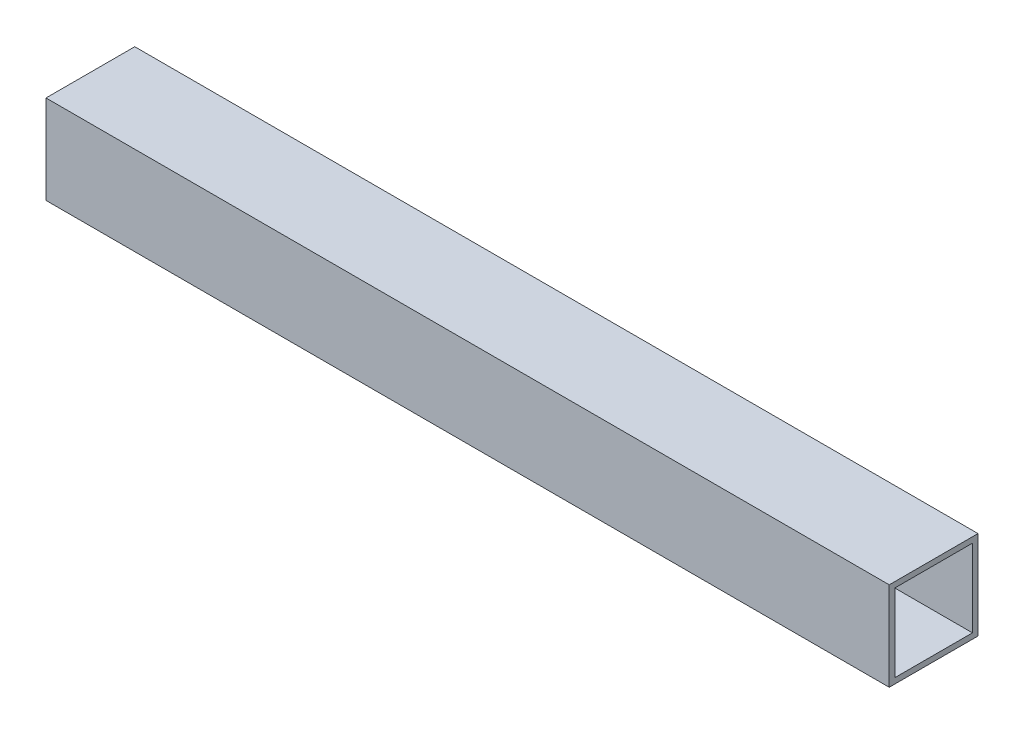
ISO-10303-21;
HEADER;
FILE_DESCRIPTION(('STEP AP214'),'2;1');
FILE_NAME('part.step','',(''),(''),'','','');
FILE_SCHEMA(('AUTOMOTIVE_DESIGN { 1 0 10303 214 1 1 1 1 }'));
ENDSEC;
DATA;
#1=APPLICATION_CONTEXT('core data for automotive mechanical design processes');
#2=APPLICATION_PROTOCOL_DEFINITION('international standard','automotive_design',2000,#1);
#3=PRODUCT_CONTEXT('',#1,'mechanical');
#4=PRODUCT('Part','Part','',(#3));
#5=PRODUCT_RELATED_PRODUCT_CATEGORY('part','',(#4));
#6=PRODUCT_DEFINITION_FORMATION('','',#4);
#7=PRODUCT_DEFINITION_CONTEXT('part definition',#1,'design');
#8=PRODUCT_DEFINITION('design','',#6,#7);
#9=PRODUCT_DEFINITION_SHAPE('','',#8);
#10=(LENGTH_UNIT() NAMED_UNIT(*) SI_UNIT(.MILLI.,.METRE.));
#11=(NAMED_UNIT(*) PLANE_ANGLE_UNIT() SI_UNIT($,.RADIAN.));
#12=(NAMED_UNIT(*) SI_UNIT($,.STERADIAN.) SOLID_ANGLE_UNIT());
#13=UNCERTAINTY_MEASURE_WITH_UNIT(LENGTH_MEASURE(1.E-05),#10,'distance_accuracy_value','');
#14=(GEOMETRIC_REPRESENTATION_CONTEXT(3) GLOBAL_UNCERTAINTY_ASSIGNED_CONTEXT((#13)) GLOBAL_UNIT_ASSIGNED_CONTEXT((#10,
#11,#12)) REPRESENTATION_CONTEXT('',''));
#15=CARTESIAN_POINT('',(0.,0.,0.));
#16=DIRECTION('',(0.,0.,1.));
#17=DIRECTION('',(1.,0.,0.));
#18=AXIS2_PLACEMENT_3D('',#15,#16,#17);
#19=CARTESIAN_POINT('',(241.3,0.,0.));
#20=DIRECTION('',(1.,0.,0.));
#21=DIRECTION('',(0.,0.,-1.));
#22=AXIS2_PLACEMENT_3D('',#19,#20,#21);
#23=PLANE('',#22);
#24=DIRECTION('',(0.,1.,0.));
#25=VECTOR('',#24,1.);
#26=CARTESIAN_POINT('',(241.3,25.4,-25.4));
#27=LINE('',#26,#25);
#28=CARTESIAN_POINT('',(241.3,-25.4,-25.4));
#29=VERTEX_POINT('',#28);
#30=CARTESIAN_POINT('',(241.3,25.4,-25.4));
#31=VERTEX_POINT('',#30);
#32=EDGE_CURVE('E138',#29,#31,#27,.T.);
#33=ORIENTED_EDGE('',*,*,#32,.T.);
#34=DIRECTION('',(0.,0.,1.));
#35=VECTOR('',#34,1.);
#36=CARTESIAN_POINT('',(241.3,25.4,25.4));
#37=LINE('',#36,#35);
#38=CARTESIAN_POINT('',(241.3,25.4,25.4));
#39=VERTEX_POINT('',#38);
#40=EDGE_CURVE('E141',#31,#39,#37,.T.);
#41=ORIENTED_EDGE('',*,*,#40,.T.);
#42=DIRECTION('',(0.,-1.,0.));
#43=VECTOR('',#42,1.);
#44=CARTESIAN_POINT('',(241.3,25.4,25.4));
#45=LINE('',#44,#43);
#46=CARTESIAN_POINT('',(241.3,-25.4,25.4));
#47=VERTEX_POINT('',#46);
#48=EDGE_CURVE('E144',#39,#47,#45,.T.);
#49=ORIENTED_EDGE('',*,*,#48,.T.);
#50=DIRECTION('',(0.,0.,-1.));
#51=VECTOR('',#50,1.);
#52=CARTESIAN_POINT('',(241.3,-25.4,25.4));
#53=LINE('',#52,#51);
#54=EDGE_CURVE('E146',#47,#29,#53,.T.);
#55=ORIENTED_EDGE('',*,*,#54,.T.);
#56=EDGE_LOOP('',(#33,#41,#49,#55));
#57=FACE_BOUND('',#56,.T.);
#58=DIRECTION('',(0.,-1.,0.));
#59=VECTOR('',#58,1.);
#60=CARTESIAN_POINT('',(241.3,22.225,22.225));
#61=LINE('',#60,#59);
#62=CARTESIAN_POINT('',(241.3,22.225,22.225));
#63=VERTEX_POINT('',#62);
#64=CARTESIAN_POINT('',(241.3,-22.225,22.225));
#65=VERTEX_POINT('',#64);
#66=EDGE_CURVE('E110',#63,#65,#61,.T.);
#67=ORIENTED_EDGE('',*,*,#66,.F.);
#68=DIRECTION('',(0.,0.,1.));
#69=VECTOR('',#68,1.);
#70=CARTESIAN_POINT('',(241.3,22.225,22.225));
#71=LINE('',#70,#69);
#72=CARTESIAN_POINT('',(241.3,22.225,-22.225));
#73=VERTEX_POINT('',#72);
#74=EDGE_CURVE('E102',#73,#63,#71,.T.);
#75=ORIENTED_EDGE('',*,*,#74,.F.);
#76=DIRECTION('',(0.,1.,0.));
#77=VECTOR('',#76,1.);
#78=CARTESIAN_POINT('',(241.3,22.225,-22.225));
#79=LINE('',#78,#77);
#80=CARTESIAN_POINT('',(241.3,-22.225,-22.225));
#81=VERTEX_POINT('',#80);
#82=EDGE_CURVE('E124',#81,#73,#79,.T.);
#83=ORIENTED_EDGE('',*,*,#82,.F.);
#84=DIRECTION('',(0.,0.,-1.));
#85=VECTOR('',#84,1.);
#86=CARTESIAN_POINT('',(241.3,-22.225,22.225));
#87=LINE('',#86,#85);
#88=EDGE_CURVE('E122',#65,#81,#87,.T.);
#89=ORIENTED_EDGE('',*,*,#88,.F.);
#90=EDGE_LOOP('',(#67,#75,#83,#89));
#91=FACE_BOUND('',#90,.T.);
#92=ADVANCED_FACE('F37',(#57,#91),#23,.T.);
#93=CARTESIAN_POINT('',(-241.3,0.,0.));
#94=DIRECTION('',(1.,0.,0.));
#95=DIRECTION('',(0.,0.,-1.));
#96=AXIS2_PLACEMENT_3D('',#93,#94,#95);
#97=PLANE('',#96);
#98=DIRECTION('',(0.,1.,0.));
#99=VECTOR('',#98,1.);
#100=CARTESIAN_POINT('',(-241.3,25.4,-25.4));
#101=LINE('',#100,#99);
#102=CARTESIAN_POINT('',(-241.3,-25.4,-25.4));
#103=VERTEX_POINT('',#102);
#104=CARTESIAN_POINT('',(-241.3,25.4,-25.4));
#105=VERTEX_POINT('',#104);
#106=EDGE_CURVE('E118',#103,#105,#101,.T.);
#107=ORIENTED_EDGE('',*,*,#106,.F.);
#108=DIRECTION('',(0.,0.,-1.));
#109=VECTOR('',#108,1.);
#110=CARTESIAN_POINT('',(-241.3,-25.4,25.4));
#111=LINE('',#110,#109);
#112=CARTESIAN_POINT('',(-241.3,-25.4,25.4));
#113=VERTEX_POINT('',#112);
#114=EDGE_CURVE('E142',#113,#103,#111,.T.);
#115=ORIENTED_EDGE('',*,*,#114,.F.);
#116=DIRECTION('',(0.,-1.,0.));
#117=VECTOR('',#116,1.);
#118=CARTESIAN_POINT('',(-241.3,25.4,25.4));
#119=LINE('',#118,#117);
#120=CARTESIAN_POINT('',(-241.3,25.4,25.4));
#121=VERTEX_POINT('',#120);
#122=EDGE_CURVE('E153',#121,#113,#119,.T.);
#123=ORIENTED_EDGE('',*,*,#122,.F.);
#124=DIRECTION('',(0.,0.,1.));
#125=VECTOR('',#124,1.);
#126=CARTESIAN_POINT('',(-241.3,25.4,25.4));
#127=LINE('',#126,#125);
#128=EDGE_CURVE('E151',#105,#121,#127,.T.);
#129=ORIENTED_EDGE('',*,*,#128,.F.);
#130=EDGE_LOOP('',(#107,#115,#123,#129));
#131=FACE_BOUND('',#130,.T.);
#132=DIRECTION('',(0.,0.,1.));
#133=VECTOR('',#132,1.);
#134=CARTESIAN_POINT('',(-241.3,22.225,22.225));
#135=LINE('',#134,#133);
#136=CARTESIAN_POINT('',(-241.3,22.225,-22.225));
#137=VERTEX_POINT('',#136);
#138=CARTESIAN_POINT('',(-241.3,22.225,22.225));
#139=VERTEX_POINT('',#138);
#140=EDGE_CURVE('E60',#137,#139,#135,.T.);
#141=ORIENTED_EDGE('',*,*,#140,.T.);
#142=DIRECTION('',(0.,-1.,0.));
#143=VECTOR('',#142,1.);
#144=CARTESIAN_POINT('',(-241.3,22.225,22.225));
#145=LINE('',#144,#143);
#146=CARTESIAN_POINT('',(-241.3,-22.225,22.225));
#147=VERTEX_POINT('',#146);
#148=EDGE_CURVE('E117',#139,#147,#145,.T.);
#149=ORIENTED_EDGE('',*,*,#148,.T.);
#150=DIRECTION('',(0.,0.,-1.));
#151=VECTOR('',#150,1.);
#152=CARTESIAN_POINT('',(-241.3,-22.225,22.225));
#153=LINE('',#152,#151);
#154=CARTESIAN_POINT('',(-241.3,-22.225,-22.225));
#155=VERTEX_POINT('',#154);
#156=EDGE_CURVE('E130',#147,#155,#153,.T.);
#157=ORIENTED_EDGE('',*,*,#156,.T.);
#158=DIRECTION('',(0.,1.,0.));
#159=VECTOR('',#158,1.);
#160=CARTESIAN_POINT('',(-241.3,22.225,-22.225));
#161=LINE('',#160,#159);
#162=EDGE_CURVE('E111',#155,#137,#161,.T.);
#163=ORIENTED_EDGE('',*,*,#162,.T.);
#164=EDGE_LOOP('',(#141,#149,#157,#163));
#165=FACE_BOUND('',#164,.T.);
#166=ADVANCED_FACE('F171',(#131,#165),#97,.F.);
#167=CARTESIAN_POINT('',(241.3,25.4,-25.4));
#168=DIRECTION('',(0.,0.,1.));
#169=DIRECTION('',(0.,-1.,0.));
#170=AXIS2_PLACEMENT_3D('',#167,#168,#169);
#171=PLANE('',#170);
#172=ORIENTED_EDGE('',*,*,#106,.T.);
#173=DIRECTION('',(-1.,0.,0.));
#174=VECTOR('',#173,1.);
#175=CARTESIAN_POINT('',(241.3,25.4,-25.4));
#176=LINE('',#175,#174);
#177=EDGE_CURVE('E11',#31,#105,#176,.T.);
#178=ORIENTED_EDGE('',*,*,#177,.F.);
#179=ORIENTED_EDGE('',*,*,#32,.F.);
#180=DIRECTION('',(-1.,0.,0.));
#181=VECTOR('',#180,1.);
#182=CARTESIAN_POINT('',(241.3,-25.4,-25.4));
#183=LINE('',#182,#181);
#184=EDGE_CURVE('E148',#29,#103,#183,.T.);
#185=ORIENTED_EDGE('',*,*,#184,.T.);
#186=EDGE_LOOP('',(#172,#178,#179,#185));
#187=FACE_BOUND('',#186,.T.);
#188=ADVANCED_FACE('F39',(#187),#171,.F.);
#189=CARTESIAN_POINT('',(241.3,25.4,25.4));
#190=DIRECTION('',(0.,-1.,0.));
#191=DIRECTION('',(0.,0.,-1.));
#192=AXIS2_PLACEMENT_3D('',#189,#190,#191);
#193=PLANE('',#192);
#194=ORIENTED_EDGE('',*,*,#128,.T.);
#195=DIRECTION('',(-1.,0.,0.));
#196=VECTOR('',#195,1.);
#197=CARTESIAN_POINT('',(241.3,25.4,25.4));
#198=LINE('',#197,#196);
#199=EDGE_CURVE('E45',#39,#121,#198,.T.);
#200=ORIENTED_EDGE('',*,*,#199,.F.);
#201=ORIENTED_EDGE('',*,*,#40,.F.);
#202=ORIENTED_EDGE('',*,*,#177,.T.);
#203=EDGE_LOOP('',(#194,#200,#201,#202));
#204=FACE_BOUND('',#203,.T.);
#205=ADVANCED_FACE('F181',(#204),#193,.F.);
#206=CARTESIAN_POINT('',(241.3,25.4,25.4));
#207=DIRECTION('',(0.,0.,-1.));
#208=DIRECTION('',(0.,1.,0.));
#209=AXIS2_PLACEMENT_3D('',#206,#207,#208);
#210=PLANE('',#209);
#211=ORIENTED_EDGE('',*,*,#122,.T.);
#212=DIRECTION('',(-1.,0.,0.));
#213=VECTOR('',#212,1.);
#214=CARTESIAN_POINT('',(241.3,-25.4,25.4));
#215=LINE('',#214,#213);
#216=EDGE_CURVE('E158',#47,#113,#215,.T.);
#217=ORIENTED_EDGE('',*,*,#216,.F.);
#218=ORIENTED_EDGE('',*,*,#48,.F.);
#219=ORIENTED_EDGE('',*,*,#199,.T.);
#220=EDGE_LOOP('',(#211,#217,#218,#219));
#221=FACE_BOUND('',#220,.T.);
#222=ADVANCED_FACE('F165',(#221),#210,.F.);
#223=CARTESIAN_POINT('',(241.3,-25.4,25.4));
#224=DIRECTION('',(0.,1.,0.));
#225=DIRECTION('',(0.,0.,1.));
#226=AXIS2_PLACEMENT_3D('',#223,#224,#225);
#227=PLANE('',#226);
#228=ORIENTED_EDGE('',*,*,#114,.T.);
#229=ORIENTED_EDGE('',*,*,#184,.F.);
#230=ORIENTED_EDGE('',*,*,#54,.F.);
#231=ORIENTED_EDGE('',*,*,#216,.T.);
#232=EDGE_LOOP('',(#228,#229,#230,#231));
#233=FACE_BOUND('',#232,.T.);
#234=ADVANCED_FACE('F175',(#233),#227,.F.);
#235=CARTESIAN_POINT('',(241.3,22.225,22.225));
#236=DIRECTION('',(0.,-1.,0.));
#237=DIRECTION('',(0.,0.,-1.));
#238=AXIS2_PLACEMENT_3D('',#235,#236,#237);
#239=PLANE('',#238);
#240=ORIENTED_EDGE('',*,*,#140,.F.);
#241=DIRECTION('',(-1.,0.,0.));
#242=VECTOR('',#241,1.);
#243=CARTESIAN_POINT('',(241.3,22.225,-22.225));
#244=LINE('',#243,#242);
#245=EDGE_CURVE('E106',#73,#137,#244,.T.);
#246=ORIENTED_EDGE('',*,*,#245,.F.);
#247=ORIENTED_EDGE('',*,*,#74,.T.);
#248=DIRECTION('',(-1.,0.,0.));
#249=VECTOR('',#248,1.);
#250=CARTESIAN_POINT('',(241.3,22.225,22.225));
#251=LINE('',#250,#249);
#252=EDGE_CURVE('E105',#63,#139,#251,.T.);
#253=ORIENTED_EDGE('',*,*,#252,.T.);
#254=EDGE_LOOP('',(#240,#246,#247,#253));
#255=FACE_BOUND('',#254,.T.);
#256=ADVANCED_FACE('F104',(#255),#239,.T.);
#257=CARTESIAN_POINT('',(241.3,22.225,22.225));
#258=DIRECTION('',(0.,0.,-1.));
#259=DIRECTION('',(0.,1.,0.));
#260=AXIS2_PLACEMENT_3D('',#257,#258,#259);
#261=PLANE('',#260);
#262=ORIENTED_EDGE('',*,*,#148,.F.);
#263=ORIENTED_EDGE('',*,*,#252,.F.);
#264=ORIENTED_EDGE('',*,*,#66,.T.);
#265=DIRECTION('',(-1.,0.,0.));
#266=VECTOR('',#265,1.);
#267=CARTESIAN_POINT('',(241.3,-22.225,22.225));
#268=LINE('',#267,#266);
#269=EDGE_CURVE('E119',#65,#147,#268,.T.);
#270=ORIENTED_EDGE('',*,*,#269,.T.);
#271=EDGE_LOOP('',(#262,#263,#264,#270));
#272=FACE_BOUND('',#271,.T.);
#273=ADVANCED_FACE('F114',(#272),#261,.T.);
#274=CARTESIAN_POINT('',(241.3,-22.225,22.225));
#275=DIRECTION('',(0.,1.,0.));
#276=DIRECTION('',(0.,0.,1.));
#277=AXIS2_PLACEMENT_3D('',#274,#275,#276);
#278=PLANE('',#277);
#279=ORIENTED_EDGE('',*,*,#156,.F.);
#280=ORIENTED_EDGE('',*,*,#269,.F.);
#281=ORIENTED_EDGE('',*,*,#88,.T.);
#282=DIRECTION('',(-1.,0.,0.));
#283=VECTOR('',#282,1.);
#284=CARTESIAN_POINT('',(241.3,-22.225,-22.225));
#285=LINE('',#284,#283);
#286=EDGE_CURVE('E52',#81,#155,#285,.T.);
#287=ORIENTED_EDGE('',*,*,#286,.T.);
#288=EDGE_LOOP('',(#279,#280,#281,#287));
#289=FACE_BOUND('',#288,.T.);
#290=ADVANCED_FACE('F204',(#289),#278,.T.);
#291=CARTESIAN_POINT('',(241.3,22.225,-22.225));
#292=DIRECTION('',(0.,0.,1.));
#293=DIRECTION('',(0.,-1.,0.));
#294=AXIS2_PLACEMENT_3D('',#291,#292,#293);
#295=PLANE('',#294);
#296=ORIENTED_EDGE('',*,*,#162,.F.);
#297=ORIENTED_EDGE('',*,*,#286,.F.);
#298=ORIENTED_EDGE('',*,*,#82,.T.);
#299=ORIENTED_EDGE('',*,*,#245,.T.);
#300=EDGE_LOOP('',(#296,#297,#298,#299));
#301=FACE_BOUND('',#300,.T.);
#302=ADVANCED_FACE('F208',(#301),#295,.T.);
#303=CLOSED_SHELL('',(#92,#166,#188,#205,#222,#234,#256,#273,#290,#302));
#304=MANIFOLD_SOLID_BREP('B2',#303);
#305=ADVANCED_BREP_SHAPE_REPRESENTATION('',(#18,#304),#14);
#306=SHAPE_DEFINITION_REPRESENTATION(#9,#305);
ENDSEC;
END-ISO-10303-21;
